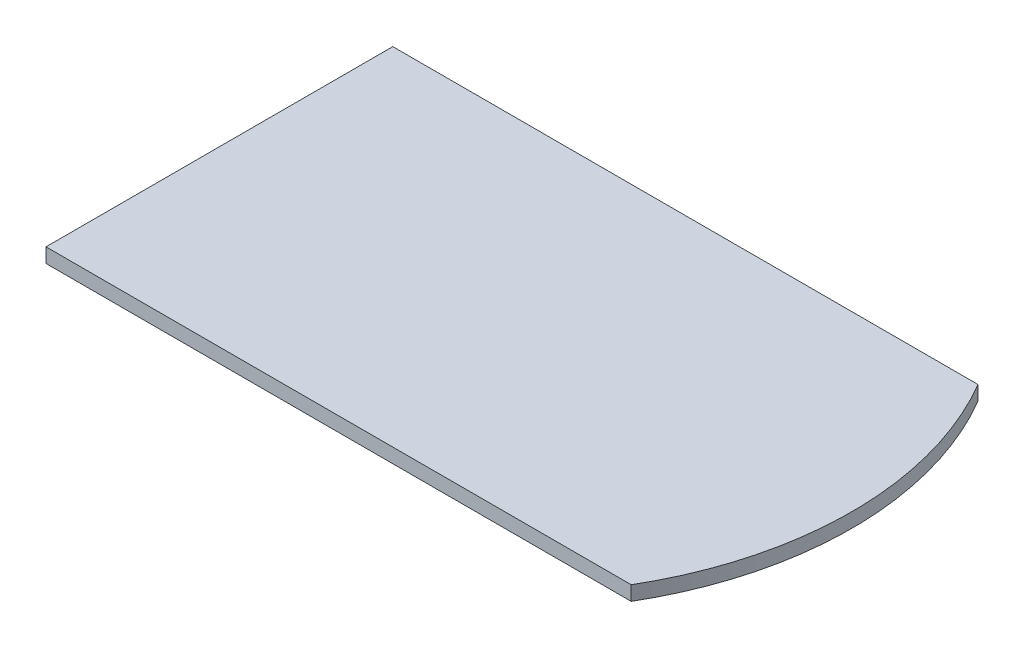
ISO-10303-21;
HEADER;
FILE_DESCRIPTION(('STEP AP214'),'2;1');
FILE_NAME('part.step','',(''),(''),'','','');
FILE_SCHEMA(('AUTOMOTIVE_DESIGN { 1 0 10303 214 1 1 1 1 }'));
ENDSEC;
DATA;
#1=APPLICATION_CONTEXT('core data for automotive mechanical design processes');
#2=APPLICATION_PROTOCOL_DEFINITION('international standard','automotive_design',2000,#1);
#3=PRODUCT_CONTEXT('',#1,'mechanical');
#4=PRODUCT('Part','Part','',(#3));
#5=PRODUCT_RELATED_PRODUCT_CATEGORY('part','',(#4));
#6=PRODUCT_DEFINITION_FORMATION('','',#4);
#7=PRODUCT_DEFINITION_CONTEXT('part definition',#1,'design');
#8=PRODUCT_DEFINITION('design','',#6,#7);
#9=PRODUCT_DEFINITION_SHAPE('','',#8);
#10=(LENGTH_UNIT() NAMED_UNIT(*) SI_UNIT(.MILLI.,.METRE.));
#11=(NAMED_UNIT(*) PLANE_ANGLE_UNIT() SI_UNIT($,.RADIAN.));
#12=(NAMED_UNIT(*) SI_UNIT($,.STERADIAN.) SOLID_ANGLE_UNIT());
#13=UNCERTAINTY_MEASURE_WITH_UNIT(LENGTH_MEASURE(1.E-05),#10,'distance_accuracy_value','');
#14=(GEOMETRIC_REPRESENTATION_CONTEXT(3) GLOBAL_UNCERTAINTY_ASSIGNED_CONTEXT((#13)) GLOBAL_UNIT_ASSIGNED_CONTEXT((#10,
#11,#12)) REPRESENTATION_CONTEXT('',''));
#15=CARTESIAN_POINT('',(0.,0.,0.));
#16=DIRECTION('',(0.,0.,1.));
#17=DIRECTION('',(1.,0.,0.));
#18=AXIS2_PLACEMENT_3D('',#15,#16,#17);
#19=CARTESIAN_POINT('',(0.,4.,96.));
#20=DIRECTION('',(0.,0.,-1.));
#21=DIRECTION('',(-1.,0.,0.));
#22=AXIS2_PLACEMENT_3D('',#19,#20,#21);
#23=PLANE('',#22);
#24=DIRECTION('',(1.,0.,0.));
#25=VECTOR('',#24,1.);
#26=CARTESIAN_POINT('',(0.,0.,96.));
#27=LINE('',#26,#25);
#28=CARTESIAN_POINT('',(0.,0.,96.));
#29=VERTEX_POINT('',#28);
#30=CARTESIAN_POINT('',(162.,0.,96.));
#31=VERTEX_POINT('',#30);
#32=EDGE_CURVE('E101',#29,#31,#27,.T.);
#33=ORIENTED_EDGE('',*,*,#32,.T.);
#34=DIRECTION('',(0.,-1.,0.));
#35=VECTOR('',#34,1.);
#36=CARTESIAN_POINT('',(162.,4.,96.));
#37=LINE('',#36,#35);
#38=CARTESIAN_POINT('',(162.,4.,96.));
#39=VERTEX_POINT('',#38);
#40=EDGE_CURVE('E11',#39,#31,#37,.T.);
#41=ORIENTED_EDGE('',*,*,#40,.F.);
#42=DIRECTION('',(1.,0.,0.));
#43=VECTOR('',#42,1.);
#44=CARTESIAN_POINT('',(0.,4.,96.));
#45=LINE('',#44,#43);
#46=CARTESIAN_POINT('',(0.,4.,96.));
#47=VERTEX_POINT('',#46);
#48=EDGE_CURVE('E86',#47,#39,#45,.T.);
#49=ORIENTED_EDGE('',*,*,#48,.F.);
#50=DIRECTION('',(0.,-1.,0.));
#51=VECTOR('',#50,1.);
#52=CARTESIAN_POINT('',(0.,4.,96.));
#53=LINE('',#52,#51);
#54=EDGE_CURVE('E97',#47,#29,#53,.T.);
#55=ORIENTED_EDGE('',*,*,#54,.T.);
#56=EDGE_LOOP('',(#33,#41,#49,#55));
#57=FACE_BOUND('',#56,.T.);
#58=ADVANCED_FACE('F39',(#57),#23,.F.);
#59=CARTESIAN_POINT('',(80.2287624969662,4.,48.));
#60=DIRECTION('',(0.,-1.,0.));
#61=DIRECTION('',(0.,0.,-1.));
#62=AXIS2_PLACEMENT_3D('',#59,#60,#61);
#63=CYLINDRICAL_SURFACE('',#62,94.8184332436345);
#64=CARTESIAN_POINT('',(80.2287624969662,0.,48.));
#65=DIRECTION('',(0.,1.,0.));
#66=DIRECTION('',(0.,0.,1.));
#67=AXIS2_PLACEMENT_3D('',#64,#65,#66);
#68=CIRCLE('',#67,94.8184332436345);
#69=CARTESIAN_POINT('',(162.,0.,0.));
#70=VERTEX_POINT('',#69);
#71=EDGE_CURVE('E91',#31,#70,#68,.T.);
#72=ORIENTED_EDGE('',*,*,#71,.T.);
#73=DIRECTION('',(0.,-1.,0.));
#74=VECTOR('',#73,1.);
#75=CARTESIAN_POINT('',(162.,4.,0.));
#76=LINE('',#75,#74);
#77=CARTESIAN_POINT('',(162.,4.,0.));
#78=VERTEX_POINT('',#77);
#79=EDGE_CURVE('E47',#78,#70,#76,.T.);
#80=ORIENTED_EDGE('',*,*,#79,.F.);
#81=CARTESIAN_POINT('',(80.2287624969662,4.,48.));
#82=DIRECTION('',(0.,1.,0.));
#83=DIRECTION('',(0.,0.,1.));
#84=AXIS2_PLACEMENT_3D('',#81,#82,#83);
#85=CIRCLE('',#84,94.8184332436345);
#86=EDGE_CURVE('E81',#39,#78,#85,.T.);
#87=ORIENTED_EDGE('',*,*,#86,.F.);
#88=ORIENTED_EDGE('',*,*,#40,.T.);
#89=EDGE_LOOP('',(#72,#80,#87,#88));
#90=FACE_BOUND('',#89,.T.);
#91=ADVANCED_FACE('F90',(#90),#63,.T.);
#92=CARTESIAN_POINT('',(0.,4.,0.));
#93=DIRECTION('',(0.,0.,-1.));
#94=DIRECTION('',(-1.,0.,0.));
#95=AXIS2_PLACEMENT_3D('',#92,#93,#94);
#96=PLANE('',#95);
#97=DIRECTION('',(1.,0.,0.));
#98=VECTOR('',#97,1.);
#99=CARTESIAN_POINT('',(0.,0.,0.));
#100=LINE('',#99,#98);
#101=CARTESIAN_POINT('',(0.,0.,0.));
#102=VERTEX_POINT('',#101);
#103=EDGE_CURVE('E105',#102,#70,#100,.T.);
#104=ORIENTED_EDGE('',*,*,#103,.F.);
#105=DIRECTION('',(0.,-1.,0.));
#106=VECTOR('',#105,1.);
#107=CARTESIAN_POINT('',(0.,4.,0.));
#108=LINE('',#107,#106);
#109=CARTESIAN_POINT('',(0.,4.,0.));
#110=VERTEX_POINT('',#109);
#111=EDGE_CURVE('E71',#110,#102,#108,.T.);
#112=ORIENTED_EDGE('',*,*,#111,.F.);
#113=DIRECTION('',(1.,0.,0.));
#114=VECTOR('',#113,1.);
#115=CARTESIAN_POINT('',(0.,4.,0.));
#116=LINE('',#115,#114);
#117=EDGE_CURVE('E84',#110,#78,#116,.T.);
#118=ORIENTED_EDGE('',*,*,#117,.T.);
#119=ORIENTED_EDGE('',*,*,#79,.T.);
#120=EDGE_LOOP('',(#104,#112,#118,#119));
#121=FACE_BOUND('',#120,.T.);
#122=ADVANCED_FACE('F95',(#121),#96,.T.);
#123=CARTESIAN_POINT('',(0.,4.,0.));
#124=DIRECTION('',(1.,0.,0.));
#125=DIRECTION('',(0.,0.,-1.));
#126=AXIS2_PLACEMENT_3D('',#123,#124,#125);
#127=PLANE('',#126);
#128=DIRECTION('',(0.,0.,1.));
#129=VECTOR('',#128,1.);
#130=CARTESIAN_POINT('',(0.,0.,0.));
#131=LINE('',#130,#129);
#132=EDGE_CURVE('E74',#102,#29,#131,.T.);
#133=ORIENTED_EDGE('',*,*,#132,.T.);
#134=ORIENTED_EDGE('',*,*,#54,.F.);
#135=DIRECTION('',(0.,0.,1.));
#136=VECTOR('',#135,1.);
#137=CARTESIAN_POINT('',(0.,4.,0.));
#138=LINE('',#137,#136);
#139=EDGE_CURVE('E55',#110,#47,#138,.T.);
#140=ORIENTED_EDGE('',*,*,#139,.F.);
#141=ORIENTED_EDGE('',*,*,#111,.T.);
#142=EDGE_LOOP('',(#133,#134,#140,#141));
#143=FACE_BOUND('',#142,.T.);
#144=ADVANCED_FACE('F118',(#143),#127,.F.);
#145=CARTESIAN_POINT('',(0.,4.,0.));
#146=DIRECTION('',(0.,1.,0.));
#147=DIRECTION('',(0.,0.,1.));
#148=AXIS2_PLACEMENT_3D('',#145,#146,#147);
#149=PLANE('',#148);
#150=ORIENTED_EDGE('',*,*,#48,.T.);
#151=ORIENTED_EDGE('',*,*,#86,.T.);
#152=ORIENTED_EDGE('',*,*,#117,.F.);
#153=ORIENTED_EDGE('',*,*,#139,.T.);
#154=EDGE_LOOP('',(#150,#151,#152,#153));
#155=FACE_BOUND('',#154,.T.);
#156=ADVANCED_FACE('F82',(#155),#149,.T.);
#157=CARTESIAN_POINT('',(0.,0.,0.));
#158=DIRECTION('',(0.,1.,0.));
#159=DIRECTION('',(0.,0.,1.));
#160=AXIS2_PLACEMENT_3D('',#157,#158,#159);
#161=PLANE('',#160);
#162=ORIENTED_EDGE('',*,*,#32,.F.);
#163=ORIENTED_EDGE('',*,*,#132,.F.);
#164=ORIENTED_EDGE('',*,*,#103,.T.);
#165=ORIENTED_EDGE('',*,*,#71,.F.);
#166=EDGE_LOOP('',(#162,#163,#164,#165));
#167=FACE_BOUND('',#166,.T.);
#168=ADVANCED_FACE('F112',(#167),#161,.F.);
#169=CLOSED_SHELL('',(#58,#91,#122,#144,#156,#168));
#170=MANIFOLD_SOLID_BREP('B2',#169);
#171=ADVANCED_BREP_SHAPE_REPRESENTATION('',(#18,#170),#14);
#172=SHAPE_DEFINITION_REPRESENTATION(#9,#171);
ENDSEC;
END-ISO-10303-21;
